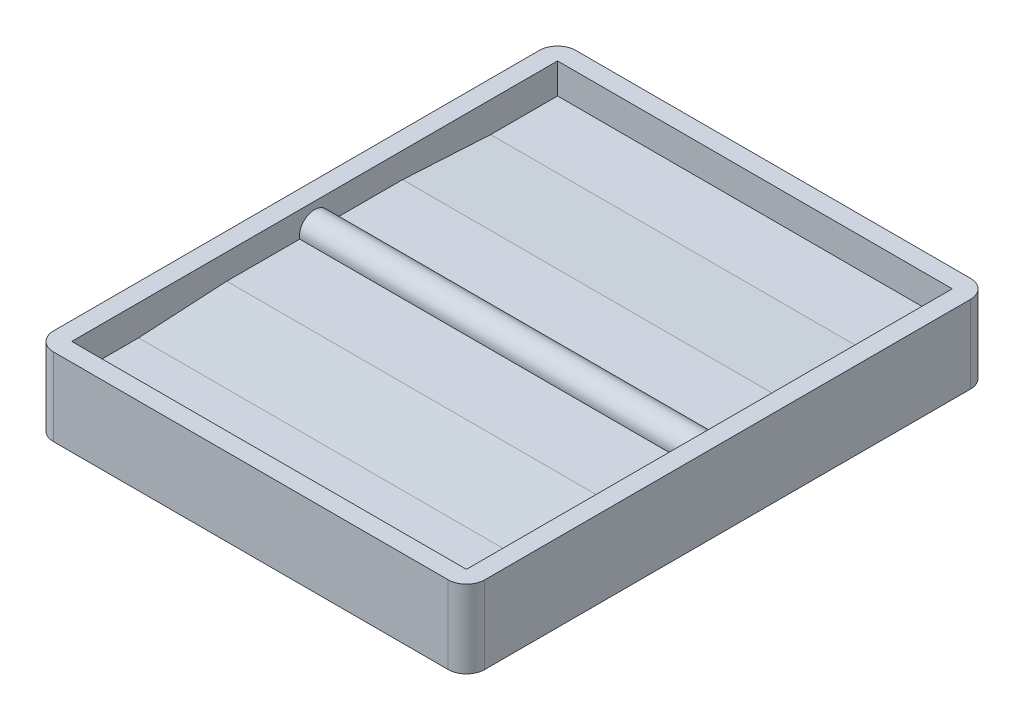
ISO-10303-21;
HEADER;
FILE_DESCRIPTION(('STEP AP214'),'2;1');
FILE_NAME('part.step','',(''),(''),'','','');
FILE_SCHEMA(('AUTOMOTIVE_DESIGN { 1 0 10303 214 1 1 1 1 }'));
ENDSEC;
DATA;
#1=APPLICATION_CONTEXT('core data for automotive mechanical design processes');
#2=APPLICATION_PROTOCOL_DEFINITION('international standard','automotive_design',2000,#1);
#3=PRODUCT_CONTEXT('',#1,'mechanical');
#4=PRODUCT('Part','Part','',(#3));
#5=PRODUCT_RELATED_PRODUCT_CATEGORY('part','',(#4));
#6=PRODUCT_DEFINITION_FORMATION('','',#4);
#7=PRODUCT_DEFINITION_CONTEXT('part definition',#1,'design');
#8=PRODUCT_DEFINITION('design','',#6,#7);
#9=PRODUCT_DEFINITION_SHAPE('','',#8);
#10=(LENGTH_UNIT() NAMED_UNIT(*) SI_UNIT(.MILLI.,.METRE.));
#11=(NAMED_UNIT(*) PLANE_ANGLE_UNIT() SI_UNIT($,.RADIAN.));
#12=(NAMED_UNIT(*) SI_UNIT($,.STERADIAN.) SOLID_ANGLE_UNIT());
#13=UNCERTAINTY_MEASURE_WITH_UNIT(LENGTH_MEASURE(1.E-05),#10,'distance_accuracy_value','');
#14=(GEOMETRIC_REPRESENTATION_CONTEXT(3) GLOBAL_UNCERTAINTY_ASSIGNED_CONTEXT((#13)) GLOBAL_UNIT_ASSIGNED_CONTEXT((#10,
#11,#12)) REPRESENTATION_CONTEXT('',''));
#15=CARTESIAN_POINT('',(0.,0.,0.));
#16=DIRECTION('',(0.,0.,1.));
#17=DIRECTION('',(1.,0.,0.));
#18=AXIS2_PLACEMENT_3D('',#15,#16,#17);
#19=CARTESIAN_POINT('',(32.5,7.8,40.));
#20=DIRECTION('',(1.,0.,0.));
#21=DIRECTION('',(0.,0.,-1.));
#22=AXIS2_PLACEMENT_3D('',#19,#20,#21);
#23=PLANE('',#22);
#24=DIRECTION('',(0.,0.,-1.));
#25=VECTOR('',#24,1.);
#26=CARTESIAN_POINT('',(32.5,8.62344705899524,-2.45481675943505));
#27=LINE('',#26,#25);
#28=CARTESIAN_POINT('',(32.5,8.62344705899524,-2.45481675943505));
#29=VERTEX_POINT('',#28);
#30=CARTESIAN_POINT('',(32.5,8.62344705899523,-14.4811222098593));
#31=VERTEX_POINT('',#30);
#32=EDGE_CURVE('E518',#29,#31,#27,.T.);
#33=ORIENTED_EDGE('',*,*,#32,.F.);
#34=CARTESIAN_POINT('',(32.5,9.09660102716714,0.));
#35=DIRECTION('',(1.,0.,0.));
#36=DIRECTION('',(0.,0.,-1.));
#37=AXIS2_PLACEMENT_3D('',#34,#35,#36);
#38=CIRCLE('',#37,2.5);
#39=CARTESIAN_POINT('',(32.5,8.61115032052088,2.45241464916043));
#40=VERTEX_POINT('',#39);
#41=EDGE_CURVE('E205',#29,#40,#38,.T.);
#42=ORIENTED_EDGE('',*,*,#41,.T.);
#43=DIRECTION('',(0.,-0.00102228206869952,-0.999999477469549));
#44=VECTOR('',#43,1.);
#45=CARTESIAN_POINT('',(32.5,8.61115032052088,2.45241464916043));
#46=LINE('',#45,#44);
#47=CARTESIAN_POINT('',(32.5,8.62344705899523,14.4811222098593));
#48=VERTEX_POINT('',#47);
#49=EDGE_CURVE('E184',#48,#40,#46,.T.);
#50=ORIENTED_EDGE('',*,*,#49,.F.);
#51=DIRECTION('',(0.,0.0566566549732099,-0.998393721658568));
#52=VECTOR('',#51,1.);
#53=CARTESIAN_POINT('',(32.5,8.62344705899523,14.4811222098593));
#54=LINE('',#53,#52);
#55=CARTESIAN_POINT('',(32.5,7.8,28.9917630905783));
#56=VERTEX_POINT('',#55);
#57=EDGE_CURVE('E189',#56,#48,#54,.T.);
#58=ORIENTED_EDGE('',*,*,#57,.F.);
#59=DIRECTION('',(0.,0.,-1.));
#60=VECTOR('',#59,1.);
#61=CARTESIAN_POINT('',(32.5,7.8,40.));
#62=LINE('',#61,#60);
#63=CARTESIAN_POINT('',(32.5,7.8,40.));
#64=VERTEX_POINT('',#63);
#65=EDGE_CURVE('E208',#64,#56,#62,.T.);
#66=ORIENTED_EDGE('',*,*,#65,.F.);
#67=DIRECTION('',(0.,1.,0.));
#68=VECTOR('',#67,1.);
#69=CARTESIAN_POINT('',(32.5,7.8,40.));
#70=LINE('',#69,#68);
#71=CARTESIAN_POINT('',(32.5,12.8,40.));
#72=VERTEX_POINT('',#71);
#73=EDGE_CURVE('E226',#64,#72,#70,.T.);
#74=ORIENTED_EDGE('',*,*,#73,.T.);
#75=DIRECTION('',(0.,0.,-1.));
#76=VECTOR('',#75,1.);
#77=CARTESIAN_POINT('',(32.5,12.8,40.));
#78=LINE('',#77,#76);
#79=CARTESIAN_POINT('',(32.5,12.8,-40.));
#80=VERTEX_POINT('',#79);
#81=EDGE_CURVE('E207',#72,#80,#78,.T.);
#82=ORIENTED_EDGE('',*,*,#81,.T.);
#83=DIRECTION('',(0.,1.,0.));
#84=VECTOR('',#83,1.);
#85=CARTESIAN_POINT('',(32.5,7.8,-40.));
#86=LINE('',#85,#84);
#87=CARTESIAN_POINT('',(32.5,7.8,-40.));
#88=VERTEX_POINT('',#87);
#89=EDGE_CURVE('E215',#88,#80,#86,.T.);
#90=ORIENTED_EDGE('',*,*,#89,.F.);
#91=CARTESIAN_POINT('',(32.5,7.8,-28.9917630905783));
#92=VERTEX_POINT('',#91);
#93=EDGE_CURVE('E211',#92,#88,#62,.T.);
#94=ORIENTED_EDGE('',*,*,#93,.F.);
#95=DIRECTION('',(0.,-0.0566566549732097,-0.998393721658568));
#96=VECTOR('',#95,1.);
#97=CARTESIAN_POINT('',(32.5,8.62344705899523,-14.4811222098593));
#98=LINE('',#97,#96);
#99=EDGE_CURVE('E48',#31,#92,#98,.T.);
#100=ORIENTED_EDGE('',*,*,#99,.F.);
#101=EDGE_LOOP('',(#33,#42,#50,#58,#66,#74,#82,#90,#94,#100));
#102=FACE_BOUND('',#101,.T.);
#103=ADVANCED_FACE('F33',(#102),#23,.F.);
#104=CARTESIAN_POINT('',(-32.5,7.8,40.));
#105=DIRECTION('',(-1.,0.,0.));
#106=DIRECTION('',(0.,0.,1.));
#107=AXIS2_PLACEMENT_3D('',#104,#105,#106);
#108=PLANE('',#107);
#109=DIRECTION('',(0.,0.,-1.));
#110=VECTOR('',#109,1.);
#111=CARTESIAN_POINT('',(-32.5,8.62344705899524,-2.45481675943505));
#112=LINE('',#111,#110);
#113=CARTESIAN_POINT('',(-32.5,8.62344705899524,-2.45481675943505));
#114=VERTEX_POINT('',#113);
#115=CARTESIAN_POINT('',(-32.5,8.62344705899523,-14.4811222098593));
#116=VERTEX_POINT('',#115);
#117=EDGE_CURVE('E56',#114,#116,#112,.T.);
#118=ORIENTED_EDGE('',*,*,#117,.T.);
#119=DIRECTION('',(0.,-0.0566566549732097,-0.998393721658568));
#120=VECTOR('',#119,1.);
#121=CARTESIAN_POINT('',(-32.5,8.62344705899523,-14.4811222098593));
#122=LINE('',#121,#120);
#123=CARTESIAN_POINT('',(-32.5,7.8,-28.9917630905783));
#124=VERTEX_POINT('',#123);
#125=EDGE_CURVE('E170',#116,#124,#122,.T.);
#126=ORIENTED_EDGE('',*,*,#125,.T.);
#127=DIRECTION('',(0.,0.,1.));
#128=VECTOR('',#127,1.);
#129=CARTESIAN_POINT('',(-32.5,7.8,40.));
#130=LINE('',#129,#128);
#131=CARTESIAN_POINT('',(-32.5,7.8,-40.));
#132=VERTEX_POINT('',#131);
#133=EDGE_CURVE('E161',#132,#124,#130,.T.);
#134=ORIENTED_EDGE('',*,*,#133,.F.);
#135=DIRECTION('',(0.,1.,0.));
#136=VECTOR('',#135,1.);
#137=CARTESIAN_POINT('',(-32.5,7.8,-40.));
#138=LINE('',#137,#136);
#139=CARTESIAN_POINT('',(-32.5,12.8,-40.));
#140=VERTEX_POINT('',#139);
#141=EDGE_CURVE('E231',#132,#140,#138,.T.);
#142=ORIENTED_EDGE('',*,*,#141,.T.);
#143=DIRECTION('',(0.,0.,1.));
#144=VECTOR('',#143,1.);
#145=CARTESIAN_POINT('',(-32.5,12.8,40.));
#146=LINE('',#145,#144);
#147=CARTESIAN_POINT('',(-32.5,12.8,40.));
#148=VERTEX_POINT('',#147);
#149=EDGE_CURVE('E220',#140,#148,#146,.T.);
#150=ORIENTED_EDGE('',*,*,#149,.T.);
#151=DIRECTION('',(0.,1.,0.));
#152=VECTOR('',#151,1.);
#153=CARTESIAN_POINT('',(-32.5,7.8,40.));
#154=LINE('',#153,#152);
#155=CARTESIAN_POINT('',(-32.5,7.8,40.));
#156=VERTEX_POINT('',#155);
#157=EDGE_CURVE('E229',#156,#148,#154,.T.);
#158=ORIENTED_EDGE('',*,*,#157,.F.);
#159=CARTESIAN_POINT('',(-32.5,7.8,28.9917630905783));
#160=VERTEX_POINT('',#159);
#161=EDGE_CURVE('E168',#160,#156,#130,.T.);
#162=ORIENTED_EDGE('',*,*,#161,.F.);
#163=DIRECTION('',(0.,0.0566566549732099,-0.998393721658568));
#164=VECTOR('',#163,1.);
#165=CARTESIAN_POINT('',(-32.5,8.62344705899523,14.4811222098593));
#166=LINE('',#165,#164);
#167=CARTESIAN_POINT('',(-32.5,8.62344705899523,14.4811222098593));
#168=VERTEX_POINT('',#167);
#169=EDGE_CURVE('E193',#160,#168,#166,.T.);
#170=ORIENTED_EDGE('',*,*,#169,.T.);
#171=DIRECTION('',(0.,-0.00102228206869952,-0.99999947746955));
#172=VECTOR('',#171,1.);
#173=CARTESIAN_POINT('',(-32.5,8.61115032052088,2.45241464916043));
#174=LINE('',#173,#172);
#175=CARTESIAN_POINT('',(-32.5,8.61115032052088,2.45241464916043));
#176=VERTEX_POINT('',#175);
#177=EDGE_CURVE('E187',#168,#176,#174,.T.);
#178=ORIENTED_EDGE('',*,*,#177,.T.);
#179=CARTESIAN_POINT('',(-32.5,9.09660102716714,0.));
#180=DIRECTION('',(1.,0.,0.));
#181=DIRECTION('',(0.,0.,-1.));
#182=AXIS2_PLACEMENT_3D('',#179,#180,#181);
#183=CIRCLE('',#182,2.5);
#184=EDGE_CURVE('E195',#114,#176,#183,.T.);
#185=ORIENTED_EDGE('',*,*,#184,.F.);
#186=EDGE_LOOP('',(#118,#126,#134,#142,#150,#158,#162,#170,#178,#185));
#187=FACE_BOUND('',#186,.T.);
#188=ADVANCED_FACE('F171',(#187),#108,.F.);
#189=CARTESIAN_POINT('',(39.5710678118655,9.09660102716714,0.));
#190=DIRECTION('',(-1.,0.,0.));
#191=DIRECTION('',(0.,0.,1.));
#192=AXIS2_PLACEMENT_3D('',#189,#190,#191);
#193=CYLINDRICAL_SURFACE('',#192,2.5);
#194=DIRECTION('',(1.,0.,0.));
#195=VECTOR('',#194,1.);
#196=CARTESIAN_POINT('',(-59.3669038451451,8.62344705899524,-2.45481675943505));
#197=LINE('',#196,#195);
#198=EDGE_CURVE('E517',#114,#29,#197,.T.);
#199=ORIENTED_EDGE('',*,*,#198,.F.);
#200=ORIENTED_EDGE('',*,*,#184,.T.);
#201=DIRECTION('',(1.,0.,0.));
#202=VECTOR('',#201,1.);
#203=CARTESIAN_POINT('',(-59.3669038451451,8.61115032052088,2.45241464916043));
#204=LINE('',#203,#202);
#205=EDGE_CURVE('E174',#176,#40,#204,.T.);
#206=ORIENTED_EDGE('',*,*,#205,.T.);
#207=ORIENTED_EDGE('',*,*,#41,.F.);
#208=EDGE_LOOP('',(#199,#200,#206,#207));
#209=FACE_BOUND('',#208,.T.);
#210=ADVANCED_FACE('F340',(#209),#193,.T.);
#211=CARTESIAN_POINT('',(0.,7.8,0.));
#212=DIRECTION('',(0.,-1.,0.));
#213=DIRECTION('',(0.,0.,-1.));
#214=AXIS2_PLACEMENT_3D('',#211,#212,#213);
#215=PLANE('',#214);
#216=DIRECTION('',(1.,0.,0.));
#217=VECTOR('',#216,1.);
#218=CARTESIAN_POINT('',(-59.3669038451451,7.8,-28.9917630905783));
#219=LINE('',#218,#217);
#220=EDGE_CURVE('E164',#124,#92,#219,.T.);
#221=ORIENTED_EDGE('',*,*,#220,.T.);
#222=ORIENTED_EDGE('',*,*,#93,.T.);
#223=DIRECTION('',(-1.,0.,0.));
#224=VECTOR('',#223,1.);
#225=CARTESIAN_POINT('',(-32.5,7.8,-40.));
#226=LINE('',#225,#224);
#227=EDGE_CURVE('E166',#88,#132,#226,.T.);
#228=ORIENTED_EDGE('',*,*,#227,.T.);
#229=ORIENTED_EDGE('',*,*,#133,.T.);
#230=EDGE_LOOP('',(#221,#222,#228,#229));
#231=FACE_BOUND('',#230,.T.);
#232=ADVANCED_FACE('F162',(#231),#215,.F.);
#233=DIRECTION('',(1.,0.,0.));
#234=VECTOR('',#233,1.);
#235=CARTESIAN_POINT('',(-59.3669038451451,7.8,28.9917630905783));
#236=LINE('',#235,#234);
#237=EDGE_CURVE('E192',#160,#56,#236,.T.);
#238=ORIENTED_EDGE('',*,*,#237,.F.);
#239=ORIENTED_EDGE('',*,*,#161,.T.);
#240=DIRECTION('',(1.,0.,0.));
#241=VECTOR('',#240,1.);
#242=CARTESIAN_POINT('',(-32.5,7.8,40.));
#243=LINE('',#242,#241);
#244=EDGE_CURVE('E167',#156,#64,#243,.T.);
#245=ORIENTED_EDGE('',*,*,#244,.T.);
#246=ORIENTED_EDGE('',*,*,#65,.T.);
#247=EDGE_LOOP('',(#238,#239,#245,#246));
#248=FACE_BOUND('',#247,.T.);
#249=ADVANCED_FACE('F441',(#248),#215,.F.);
#250=CARTESIAN_POINT('',(-32.5,12.8,40.));
#251=DIRECTION('',(0.,-1.,0.));
#252=DIRECTION('',(0.,0.,-1.));
#253=AXIS2_PLACEMENT_3D('',#250,#251,#252);
#254=CYLINDRICAL_SURFACE('',#253,3.);
#255=CARTESIAN_POINT('',(-32.5,0.,40.));
#256=DIRECTION('',(0.,1.,0.));
#257=DIRECTION('',(0.,0.,-1.));
#258=AXIS2_PLACEMENT_3D('',#255,#256,#257);
#259=CIRCLE('',#258,3.);
#260=CARTESIAN_POINT('',(-35.5,0.,40.));
#261=VERTEX_POINT('',#260);
#262=CARTESIAN_POINT('',(-32.5,0.,43.));
#263=VERTEX_POINT('',#262);
#264=EDGE_CURVE('E228',#261,#263,#259,.T.);
#265=ORIENTED_EDGE('',*,*,#264,.T.);
#266=DIRECTION('',(0.,-1.,0.));
#267=VECTOR('',#266,1.);
#268=CARTESIAN_POINT('',(-32.5,12.8,43.));
#269=LINE('',#268,#267);
#270=CARTESIAN_POINT('',(-32.5,12.8,43.));
#271=VERTEX_POINT('',#270);
#272=EDGE_CURVE('E11',#271,#263,#269,.T.);
#273=ORIENTED_EDGE('',*,*,#272,.F.);
#274=CARTESIAN_POINT('',(-32.5,12.8,40.));
#275=DIRECTION('',(0.,1.,0.));
#276=DIRECTION('',(0.,0.,-1.));
#277=AXIS2_PLACEMENT_3D('',#274,#275,#276);
#278=CIRCLE('',#277,3.);
#279=CARTESIAN_POINT('',(-35.5,12.8,40.));
#280=VERTEX_POINT('',#279);
#281=EDGE_CURVE('E235',#280,#271,#278,.T.);
#282=ORIENTED_EDGE('',*,*,#281,.F.);
#283=DIRECTION('',(0.,-1.,0.));
#284=VECTOR('',#283,1.);
#285=CARTESIAN_POINT('',(-35.5,12.8,40.));
#286=LINE('',#285,#284);
#287=EDGE_CURVE('E253',#280,#261,#286,.T.);
#288=ORIENTED_EDGE('',*,*,#287,.T.);
#289=EDGE_LOOP('',(#265,#273,#282,#288));
#290=FACE_BOUND('',#289,.T.);
#291=ADVANCED_FACE('F35',(#290),#254,.T.);
#292=CARTESIAN_POINT('',(-32.5,12.8,43.));
#293=DIRECTION('',(0.,0.,-1.));
#294=DIRECTION('',(-1.,0.,0.));
#295=AXIS2_PLACEMENT_3D('',#292,#293,#294);
#296=PLANE('',#295);
#297=DIRECTION('',(1.,0.,0.));
#298=VECTOR('',#297,1.);
#299=CARTESIAN_POINT('',(-32.5,0.,43.));
#300=LINE('',#299,#298);
#301=CARTESIAN_POINT('',(32.5,0.,43.));
#302=VERTEX_POINT('',#301);
#303=EDGE_CURVE('E256',#263,#302,#300,.T.);
#304=ORIENTED_EDGE('',*,*,#303,.T.);
#305=DIRECTION('',(0.,-1.,0.));
#306=VECTOR('',#305,1.);
#307=CARTESIAN_POINT('',(32.5,12.8,43.));
#308=LINE('',#307,#306);
#309=CARTESIAN_POINT('',(32.5,12.8,43.));
#310=VERTEX_POINT('',#309);
#311=EDGE_CURVE('E41',#310,#302,#308,.T.);
#312=ORIENTED_EDGE('',*,*,#311,.F.);
#313=DIRECTION('',(1.,0.,0.));
#314=VECTOR('',#313,1.);
#315=CARTESIAN_POINT('',(-32.5,12.8,43.));
#316=LINE('',#315,#314);
#317=EDGE_CURVE('E238',#271,#310,#316,.T.);
#318=ORIENTED_EDGE('',*,*,#317,.F.);
#319=ORIENTED_EDGE('',*,*,#272,.T.);
#320=EDGE_LOOP('',(#304,#312,#318,#319));
#321=FACE_BOUND('',#320,.T.);
#322=ADVANCED_FACE('F313',(#321),#296,.F.);
#323=CARTESIAN_POINT('',(32.5,12.8,40.));
#324=DIRECTION('',(0.,-1.,0.));
#325=DIRECTION('',(0.,0.,-1.));
#326=AXIS2_PLACEMENT_3D('',#323,#324,#325);
#327=CYLINDRICAL_SURFACE('',#326,3.);
#328=CARTESIAN_POINT('',(32.5,0.,40.));
#329=DIRECTION('',(0.,1.,0.));
#330=DIRECTION('',(0.,0.,1.));
#331=AXIS2_PLACEMENT_3D('',#328,#329,#330);
#332=CIRCLE('',#331,3.);
#333=CARTESIAN_POINT('',(35.5,0.,40.));
#334=VERTEX_POINT('',#333);
#335=EDGE_CURVE('E258',#302,#334,#332,.T.);
#336=ORIENTED_EDGE('',*,*,#335,.T.);
#337=DIRECTION('',(0.,-1.,0.));
#338=VECTOR('',#337,1.);
#339=CARTESIAN_POINT('',(35.5,12.8,40.));
#340=LINE('',#339,#338);
#341=CARTESIAN_POINT('',(35.5,12.8,40.));
#342=VERTEX_POINT('',#341);
#343=EDGE_CURVE('E283',#342,#334,#340,.T.);
#344=ORIENTED_EDGE('',*,*,#343,.F.);
#345=CARTESIAN_POINT('',(32.5,12.8,40.));
#346=DIRECTION('',(0.,1.,0.));
#347=DIRECTION('',(0.,0.,1.));
#348=AXIS2_PLACEMENT_3D('',#345,#346,#347);
#349=CIRCLE('',#348,3.);
#350=EDGE_CURVE('E241',#310,#342,#349,.T.);
#351=ORIENTED_EDGE('',*,*,#350,.F.);
#352=ORIENTED_EDGE('',*,*,#311,.T.);
#353=EDGE_LOOP('',(#336,#344,#351,#352));
#354=FACE_BOUND('',#353,.T.);
#355=ADVANCED_FACE('F290',(#354),#327,.T.);
#356=CARTESIAN_POINT('',(35.5,12.8,40.));
#357=DIRECTION('',(-1.,0.,0.));
#358=DIRECTION('',(0.,0.,1.));
#359=AXIS2_PLACEMENT_3D('',#356,#357,#358);
#360=PLANE('',#359);
#361=DIRECTION('',(0.,0.,-1.));
#362=VECTOR('',#361,1.);
#363=CARTESIAN_POINT('',(35.5,0.,40.));
#364=LINE('',#363,#362);
#365=CARTESIAN_POINT('',(35.5,0.,-40.));
#366=VERTEX_POINT('',#365);
#367=EDGE_CURVE('E260',#334,#366,#364,.T.);
#368=ORIENTED_EDGE('',*,*,#367,.T.);
#369=DIRECTION('',(0.,-1.,0.));
#370=VECTOR('',#369,1.);
#371=CARTESIAN_POINT('',(35.5,12.8,-40.));
#372=LINE('',#371,#370);
#373=CARTESIAN_POINT('',(35.5,12.8,-40.));
#374=VERTEX_POINT('',#373);
#375=EDGE_CURVE('E280',#374,#366,#372,.T.);
#376=ORIENTED_EDGE('',*,*,#375,.F.);
#377=DIRECTION('',(0.,0.,-1.));
#378=VECTOR('',#377,1.);
#379=CARTESIAN_POINT('',(35.5,12.8,40.));
#380=LINE('',#379,#378);
#381=EDGE_CURVE('E243',#342,#374,#380,.T.);
#382=ORIENTED_EDGE('',*,*,#381,.F.);
#383=ORIENTED_EDGE('',*,*,#343,.T.);
#384=EDGE_LOOP('',(#368,#376,#382,#383));
#385=FACE_BOUND('',#384,.T.);
#386=ADVANCED_FACE('F301',(#385),#360,.F.);
#387=CARTESIAN_POINT('',(32.5,12.8,-40.));
#388=DIRECTION('',(0.,-1.,0.));
#389=DIRECTION('',(0.,0.,-1.));
#390=AXIS2_PLACEMENT_3D('',#387,#388,#389);
#391=CYLINDRICAL_SURFACE('',#390,3.);
#392=CARTESIAN_POINT('',(32.5,0.,-40.));
#393=DIRECTION('',(0.,1.,0.));
#394=DIRECTION('',(0.,0.,1.));
#395=AXIS2_PLACEMENT_3D('',#392,#393,#394);
#396=CIRCLE('',#395,3.);
#397=CARTESIAN_POINT('',(32.5,0.,-43.));
#398=VERTEX_POINT('',#397);
#399=EDGE_CURVE('E262',#366,#398,#396,.T.);
#400=ORIENTED_EDGE('',*,*,#399,.T.);
#401=DIRECTION('',(0.,-1.,0.));
#402=VECTOR('',#401,1.);
#403=CARTESIAN_POINT('',(32.5,12.8,-43.));
#404=LINE('',#403,#402);
#405=CARTESIAN_POINT('',(32.5,12.8,-43.));
#406=VERTEX_POINT('',#405);
#407=EDGE_CURVE('E277',#406,#398,#404,.T.);
#408=ORIENTED_EDGE('',*,*,#407,.F.);
#409=CARTESIAN_POINT('',(32.5,12.8,-40.));
#410=DIRECTION('',(0.,1.,0.));
#411=DIRECTION('',(0.,0.,1.));
#412=AXIS2_PLACEMENT_3D('',#409,#410,#411);
#413=CIRCLE('',#412,3.);
#414=EDGE_CURVE('E245',#374,#406,#413,.T.);
#415=ORIENTED_EDGE('',*,*,#414,.F.);
#416=ORIENTED_EDGE('',*,*,#375,.T.);
#417=EDGE_LOOP('',(#400,#408,#415,#416));
#418=FACE_BOUND('',#417,.T.);
#419=ADVANCED_FACE('F305',(#418),#391,.T.);
#420=CARTESIAN_POINT('',(-32.5,12.8,-43.));
#421=DIRECTION('',(0.,0.,1.));
#422=DIRECTION('',(1.,0.,0.));
#423=AXIS2_PLACEMENT_3D('',#420,#421,#422);
#424=PLANE('',#423);
#425=DIRECTION('',(-1.,0.,0.));
#426=VECTOR('',#425,1.);
#427=CARTESIAN_POINT('',(-32.5,0.,-43.));
#428=LINE('',#427,#426);
#429=CARTESIAN_POINT('',(-32.5,0.,-43.));
#430=VERTEX_POINT('',#429);
#431=EDGE_CURVE('E264',#398,#430,#428,.T.);
#432=ORIENTED_EDGE('',*,*,#431,.T.);
#433=DIRECTION('',(0.,-1.,0.));
#434=VECTOR('',#433,1.);
#435=CARTESIAN_POINT('',(-32.5,12.8,-43.));
#436=LINE('',#435,#434);
#437=CARTESIAN_POINT('',(-32.5,12.8,-43.));
#438=VERTEX_POINT('',#437);
#439=EDGE_CURVE('E274',#438,#430,#436,.T.);
#440=ORIENTED_EDGE('',*,*,#439,.F.);
#441=DIRECTION('',(-1.,0.,0.));
#442=VECTOR('',#441,1.);
#443=CARTESIAN_POINT('',(-32.5,12.8,-43.));
#444=LINE('',#443,#442);
#445=EDGE_CURVE('E247',#406,#438,#444,.T.);
#446=ORIENTED_EDGE('',*,*,#445,.F.);
#447=ORIENTED_EDGE('',*,*,#407,.T.);
#448=EDGE_LOOP('',(#432,#440,#446,#447));
#449=FACE_BOUND('',#448,.T.);
#450=ADVANCED_FACE('F326',(#449),#424,.F.);
#451=CARTESIAN_POINT('',(-32.5,12.8,-40.));
#452=DIRECTION('',(0.,-1.,0.));
#453=DIRECTION('',(0.,0.,-1.));
#454=AXIS2_PLACEMENT_3D('',#451,#452,#453);
#455=CYLINDRICAL_SURFACE('',#454,3.);
#456=CARTESIAN_POINT('',(-32.5,0.,-40.));
#457=DIRECTION('',(0.,1.,0.));
#458=DIRECTION('',(0.,0.,-1.));
#459=AXIS2_PLACEMENT_3D('',#456,#457,#458);
#460=CIRCLE('',#459,3.);
#461=CARTESIAN_POINT('',(-35.5,0.,-40.));
#462=VERTEX_POINT('',#461);
#463=EDGE_CURVE('E266',#430,#462,#460,.T.);
#464=ORIENTED_EDGE('',*,*,#463,.T.);
#465=DIRECTION('',(0.,-1.,0.));
#466=VECTOR('',#465,1.);
#467=CARTESIAN_POINT('',(-35.5,12.8,-40.));
#468=LINE('',#467,#466);
#469=CARTESIAN_POINT('',(-35.5,12.8,-40.));
#470=VERTEX_POINT('',#469);
#471=EDGE_CURVE('E271',#470,#462,#468,.T.);
#472=ORIENTED_EDGE('',*,*,#471,.F.);
#473=CARTESIAN_POINT('',(-32.5,12.8,-40.));
#474=DIRECTION('',(0.,1.,0.));
#475=DIRECTION('',(0.,0.,-1.));
#476=AXIS2_PLACEMENT_3D('',#473,#474,#475);
#477=CIRCLE('',#476,3.);
#478=EDGE_CURVE('E249',#438,#470,#477,.T.);
#479=ORIENTED_EDGE('',*,*,#478,.F.);
#480=ORIENTED_EDGE('',*,*,#439,.T.);
#481=EDGE_LOOP('',(#464,#472,#479,#480));
#482=FACE_BOUND('',#481,.T.);
#483=ADVANCED_FACE('F324',(#482),#455,.T.);
#484=CARTESIAN_POINT('',(-35.5,12.8,40.));
#485=DIRECTION('',(1.,0.,0.));
#486=DIRECTION('',(0.,0.,-1.));
#487=AXIS2_PLACEMENT_3D('',#484,#485,#486);
#488=PLANE('',#487);
#489=DIRECTION('',(0.,0.,1.));
#490=VECTOR('',#489,1.);
#491=CARTESIAN_POINT('',(-35.5,0.,40.));
#492=LINE('',#491,#490);
#493=EDGE_CURVE('E239',#462,#261,#492,.T.);
#494=ORIENTED_EDGE('',*,*,#493,.T.);
#495=ORIENTED_EDGE('',*,*,#287,.F.);
#496=DIRECTION('',(0.,0.,1.));
#497=VECTOR('',#496,1.);
#498=CARTESIAN_POINT('',(-35.5,12.8,40.));
#499=LINE('',#498,#497);
#500=EDGE_CURVE('E251',#470,#280,#499,.T.);
#501=ORIENTED_EDGE('',*,*,#500,.F.);
#502=ORIENTED_EDGE('',*,*,#471,.T.);
#503=EDGE_LOOP('',(#494,#495,#501,#502));
#504=FACE_BOUND('',#503,.T.);
#505=ADVANCED_FACE('F319',(#504),#488,.F.);
#506=CARTESIAN_POINT('',(-32.5,12.8,40.));
#507=DIRECTION('',(0.,-1.,0.));
#508=DIRECTION('',(0.,0.,-1.));
#509=AXIS2_PLACEMENT_3D('',#506,#507,#508);
#510=PLANE('',#509);
#511=DIRECTION('',(-1.,0.,0.));
#512=VECTOR('',#511,1.);
#513=CARTESIAN_POINT('',(-32.5,12.8,-40.));
#514=LINE('',#513,#512);
#515=EDGE_CURVE('E217',#80,#140,#514,.T.);
#516=ORIENTED_EDGE('',*,*,#515,.F.);
#517=ORIENTED_EDGE('',*,*,#81,.F.);
#518=DIRECTION('',(1.,0.,0.));
#519=VECTOR('',#518,1.);
#520=CARTESIAN_POINT('',(-32.5,12.8,40.));
#521=LINE('',#520,#519);
#522=EDGE_CURVE('E223',#148,#72,#521,.T.);
#523=ORIENTED_EDGE('',*,*,#522,.F.);
#524=ORIENTED_EDGE('',*,*,#149,.F.);
#525=EDGE_LOOP('',(#516,#517,#523,#524));
#526=FACE_BOUND('',#525,.T.);
#527=ORIENTED_EDGE('',*,*,#281,.T.);
#528=ORIENTED_EDGE('',*,*,#317,.T.);
#529=ORIENTED_EDGE('',*,*,#350,.T.);
#530=ORIENTED_EDGE('',*,*,#381,.T.);
#531=ORIENTED_EDGE('',*,*,#414,.T.);
#532=ORIENTED_EDGE('',*,*,#445,.T.);
#533=ORIENTED_EDGE('',*,*,#478,.T.);
#534=ORIENTED_EDGE('',*,*,#500,.T.);
#535=EDGE_LOOP('',(#527,#528,#529,#530,#531,#532,#533,#534));
#536=FACE_BOUND('',#535,.T.);
#537=ADVANCED_FACE('F309',(#526,#536),#510,.F.);
#538=CARTESIAN_POINT('',(-32.5,0.,40.));
#539=DIRECTION('',(0.,-1.,0.));
#540=DIRECTION('',(0.,0.,-1.));
#541=AXIS2_PLACEMENT_3D('',#538,#539,#540);
#542=PLANE('',#541);
#543=ORIENTED_EDGE('',*,*,#264,.F.);
#544=ORIENTED_EDGE('',*,*,#493,.F.);
#545=ORIENTED_EDGE('',*,*,#463,.F.);
#546=ORIENTED_EDGE('',*,*,#431,.F.);
#547=ORIENTED_EDGE('',*,*,#399,.F.);
#548=ORIENTED_EDGE('',*,*,#367,.F.);
#549=ORIENTED_EDGE('',*,*,#335,.F.);
#550=ORIENTED_EDGE('',*,*,#303,.F.);
#551=EDGE_LOOP('',(#543,#544,#545,#546,#547,#548,#549,#550));
#552=FACE_BOUND('',#551,.T.);
#553=ADVANCED_FACE('F296',(#552),#542,.T.);
#554=CARTESIAN_POINT('',(-32.5,7.8,40.));
#555=DIRECTION('',(0.,0.,1.));
#556=DIRECTION('',(1.,0.,0.));
#557=AXIS2_PLACEMENT_3D('',#554,#555,#556);
#558=PLANE('',#557);
#559=ORIENTED_EDGE('',*,*,#522,.T.);
#560=ORIENTED_EDGE('',*,*,#73,.F.);
#561=ORIENTED_EDGE('',*,*,#244,.F.);
#562=ORIENTED_EDGE('',*,*,#157,.T.);
#563=EDGE_LOOP('',(#559,#560,#561,#562));
#564=FACE_BOUND('',#563,.T.);
#565=ADVANCED_FACE('F350',(#564),#558,.F.);
#566=CARTESIAN_POINT('',(-32.5,7.8,-40.));
#567=DIRECTION('',(0.,0.,-1.));
#568=DIRECTION('',(-1.,0.,0.));
#569=AXIS2_PLACEMENT_3D('',#566,#567,#568);
#570=PLANE('',#569);
#571=ORIENTED_EDGE('',*,*,#515,.T.);
#572=ORIENTED_EDGE('',*,*,#141,.F.);
#573=ORIENTED_EDGE('',*,*,#227,.F.);
#574=ORIENTED_EDGE('',*,*,#89,.T.);
#575=EDGE_LOOP('',(#571,#572,#573,#574));
#576=FACE_BOUND('',#575,.T.);
#577=ADVANCED_FACE('F344',(#576),#570,.F.);
#578=CARTESIAN_POINT('',(-59.3669038451451,8.62344705899523,14.4811222098593));
#579=DIRECTION('',(0.,-0.998393721658568,-0.0566566549732099));
#580=DIRECTION('',(0.,0.0566566549732099,-0.998393721658568));
#581=AXIS2_PLACEMENT_3D('',#578,#579,#580);
#582=PLANE('',#581);
#583=ORIENTED_EDGE('',*,*,#169,.F.);
#584=ORIENTED_EDGE('',*,*,#237,.T.);
#585=ORIENTED_EDGE('',*,*,#57,.T.);
#586=DIRECTION('',(1.,0.,0.));
#587=VECTOR('',#586,1.);
#588=CARTESIAN_POINT('',(-59.3669038451451,8.62344705899523,14.4811222098593));
#589=LINE('',#588,#587);
#590=EDGE_CURVE('E188',#168,#48,#589,.T.);
#591=ORIENTED_EDGE('',*,*,#590,.F.);
#592=EDGE_LOOP('',(#583,#584,#585,#591));
#593=FACE_BOUND('',#592,.T.);
#594=ADVANCED_FACE('F377',(#593),#582,.F.);
#595=CARTESIAN_POINT('',(-59.3669038451451,8.61115032052088,2.45241464916043));
#596=DIRECTION('',(0.,-0.999999477469549,0.00102228206869952));
#597=DIRECTION('',(0.,-0.00102228206869952,-0.99999947746955));
#598=AXIS2_PLACEMENT_3D('',#595,#596,#597);
#599=PLANE('',#598);
#600=ORIENTED_EDGE('',*,*,#177,.F.);
#601=ORIENTED_EDGE('',*,*,#590,.T.);
#602=ORIENTED_EDGE('',*,*,#49,.T.);
#603=ORIENTED_EDGE('',*,*,#205,.F.);
#604=EDGE_LOOP('',(#600,#601,#602,#603));
#605=FACE_BOUND('',#604,.T.);
#606=ADVANCED_FACE('F384',(#605),#599,.F.);
#607=CARTESIAN_POINT('',(-59.3669038451451,8.62344705899524,-2.45481675943505));
#608=DIRECTION('',(0.,-1.,0.));
#609=DIRECTION('',(0.,0.,-1.));
#610=AXIS2_PLACEMENT_3D('',#607,#608,#609);
#611=PLANE('',#610);
#612=ORIENTED_EDGE('',*,*,#117,.F.);
#613=ORIENTED_EDGE('',*,*,#198,.T.);
#614=ORIENTED_EDGE('',*,*,#32,.T.);
#615=DIRECTION('',(1.,0.,0.));
#616=VECTOR('',#615,1.);
#617=CARTESIAN_POINT('',(-59.3669038451451,8.62344705899523,-14.4811222098593));
#618=LINE('',#617,#616);
#619=EDGE_CURVE('E179',#116,#31,#618,.T.);
#620=ORIENTED_EDGE('',*,*,#619,.F.);
#621=EDGE_LOOP('',(#612,#613,#614,#620));
#622=FACE_BOUND('',#621,.T.);
#623=ADVANCED_FACE('F393',(#622),#611,.F.);
#624=CARTESIAN_POINT('',(-59.3669038451451,8.62344705899523,-14.4811222098593));
#625=DIRECTION('',(0.,-0.998393721658568,0.0566566549732097));
#626=DIRECTION('',(0.,-0.0566566549732097,-0.998393721658568));
#627=AXIS2_PLACEMENT_3D('',#624,#625,#626);
#628=PLANE('',#627);
#629=ORIENTED_EDGE('',*,*,#125,.F.);
#630=ORIENTED_EDGE('',*,*,#619,.T.);
#631=ORIENTED_EDGE('',*,*,#99,.T.);
#632=ORIENTED_EDGE('',*,*,#220,.F.);
#633=EDGE_LOOP('',(#629,#630,#631,#632));
#634=FACE_BOUND('',#633,.T.);
#635=ADVANCED_FACE('F176',(#634),#628,.F.);
#636=CLOSED_SHELL('',(#103,#188,#210,#232,#249,#291,#322,#355,#386,#419,#450,#483,#505,#537,
#553,#565,#577,#594,#606,#623,#635));
#637=MANIFOLD_SOLID_BREP('B2',#636);
#638=ADVANCED_BREP_SHAPE_REPRESENTATION('',(#18,#637),#14);
#639=SHAPE_DEFINITION_REPRESENTATION(#9,#638);
ENDSEC;
END-ISO-10303-21;
